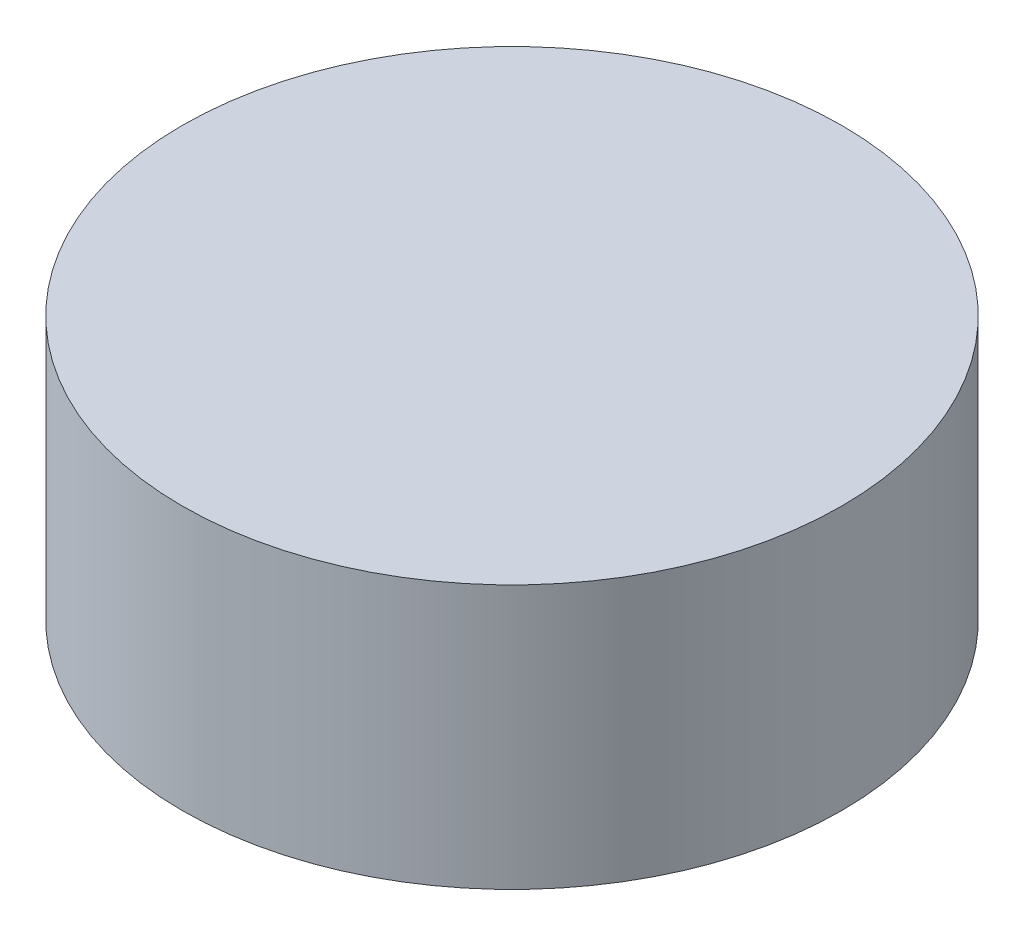
ISO-10303-21;
HEADER;
FILE_DESCRIPTION(('STEP AP214'),'2;1');
FILE_NAME('part.step','',(''),(''),'','','');
FILE_SCHEMA(('AUTOMOTIVE_DESIGN { 1 0 10303 214 1 1 1 1 }'));
ENDSEC;
DATA;
#1=APPLICATION_CONTEXT('core data for automotive mechanical design processes');
#2=APPLICATION_PROTOCOL_DEFINITION('international standard','automotive_design',2000,#1);
#3=PRODUCT_CONTEXT('',#1,'mechanical');
#4=PRODUCT('Part','Part','',(#3));
#5=PRODUCT_RELATED_PRODUCT_CATEGORY('part','',(#4));
#6=PRODUCT_DEFINITION_FORMATION('','',#4);
#7=PRODUCT_DEFINITION_CONTEXT('part definition',#1,'design');
#8=PRODUCT_DEFINITION('design','',#6,#7);
#9=PRODUCT_DEFINITION_SHAPE('','',#8);
#10=(LENGTH_UNIT() NAMED_UNIT(*) SI_UNIT(.MILLI.,.METRE.));
#11=(NAMED_UNIT(*) PLANE_ANGLE_UNIT() SI_UNIT($,.RADIAN.));
#12=(NAMED_UNIT(*) SI_UNIT($,.STERADIAN.) SOLID_ANGLE_UNIT());
#13=UNCERTAINTY_MEASURE_WITH_UNIT(LENGTH_MEASURE(1.E-05),#10,'distance_accuracy_value','');
#14=(GEOMETRIC_REPRESENTATION_CONTEXT(3) GLOBAL_UNCERTAINTY_ASSIGNED_CONTEXT((#13)) GLOBAL_UNIT_ASSIGNED_CONTEXT((#10,
#11,#12)) REPRESENTATION_CONTEXT('',''));
#15=CARTESIAN_POINT('',(0.,0.,0.));
#16=DIRECTION('',(0.,0.,1.));
#17=DIRECTION('',(1.,0.,0.));
#18=AXIS2_PLACEMENT_3D('',#15,#16,#17);
#19=CARTESIAN_POINT('',(0.,2.54,0.));
#20=DIRECTION('',(0.,-1.,0.));
#21=DIRECTION('',(0.,0.,-1.));
#22=AXIS2_PLACEMENT_3D('',#19,#20,#21);
#23=CYLINDRICAL_SURFACE('',#22,3.175);
#24=CARTESIAN_POINT('',(0.,2.54,0.));
#25=DIRECTION('',(0.,1.,0.));
#26=DIRECTION('',(0.,0.,1.));
#27=AXIS2_PLACEMENT_3D('',#24,#25,#26);
#28=CIRCLE('',#27,3.175);
#29=CARTESIAN_POINT('',(0.,2.54,3.175));
#30=VERTEX_POINT('',#29);
#31=EDGE_CURVE('E10',#30,#30,#28,.T.);
#32=ORIENTED_EDGE('',*,*,#31,.F.);
#33=EDGE_LOOP('',(#32));
#34=FACE_BOUND('',#33,.T.);
#35=CARTESIAN_POINT('',(0.,0.,0.));
#36=DIRECTION('',(0.,1.,0.));
#37=DIRECTION('',(0.,0.,1.));
#38=AXIS2_PLACEMENT_3D('',#35,#36,#37);
#39=CIRCLE('',#38,3.175);
#40=CARTESIAN_POINT('',(0.,0.,3.175));
#41=VERTEX_POINT('',#40);
#42=EDGE_CURVE('E34',#41,#41,#39,.T.);
#43=ORIENTED_EDGE('',*,*,#42,.T.);
#44=EDGE_LOOP('',(#43));
#45=FACE_BOUND('',#44,.T.);
#46=ADVANCED_FACE('F31',(#34,#45),#23,.T.);
#47=CARTESIAN_POINT('',(0.,2.54,0.));
#48=DIRECTION('',(0.,1.,0.));
#49=DIRECTION('',(0.,0.,1.));
#50=AXIS2_PLACEMENT_3D('',#47,#48,#49);
#51=PLANE('',#50);
#52=ORIENTED_EDGE('',*,*,#31,.T.);
#53=EDGE_LOOP('',(#52));
#54=FACE_BOUND('',#53,.T.);
#55=ADVANCED_FACE('F46',(#54),#51,.T.);
#56=CARTESIAN_POINT('',(0.,0.,0.));
#57=DIRECTION('',(0.,1.,0.));
#58=DIRECTION('',(0.,0.,1.));
#59=AXIS2_PLACEMENT_3D('',#56,#57,#58);
#60=PLANE('',#59);
#61=ORIENTED_EDGE('',*,*,#42,.F.);
#62=EDGE_LOOP('',(#61));
#63=FACE_BOUND('',#62,.T.);
#64=ADVANCED_FACE('F44',(#63),#60,.F.);
#65=CLOSED_SHELL('',(#46,#55,#64));
#66=MANIFOLD_SOLID_BREP('B2',#65);
#67=ADVANCED_BREP_SHAPE_REPRESENTATION('',(#18,#66),#14);
#68=SHAPE_DEFINITION_REPRESENTATION(#9,#67);
ENDSEC;
END-ISO-10303-21;
